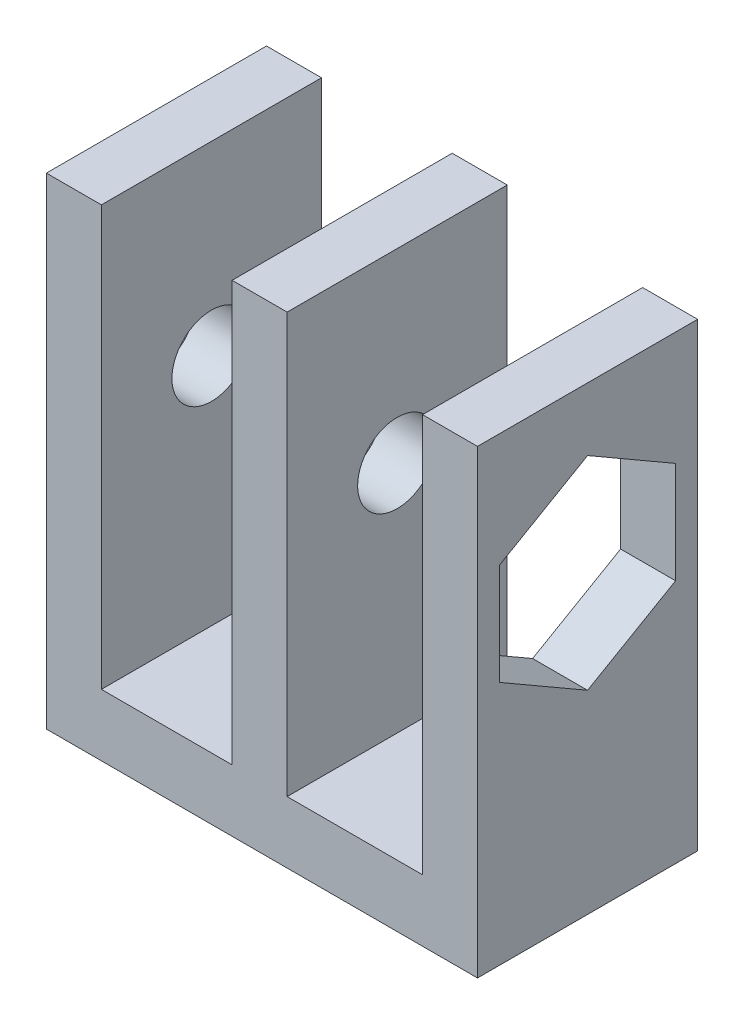
ISO-10303-21;
HEADER;
FILE_DESCRIPTION(('STEP AP214'),'2;1');
FILE_NAME('part.step','',(''),(''),'','','');
FILE_SCHEMA(('AUTOMOTIVE_DESIGN { 1 0 10303 214 1 1 1 1 }'));
ENDSEC;
DATA;
#1=APPLICATION_CONTEXT('core data for automotive mechanical design processes');
#2=APPLICATION_PROTOCOL_DEFINITION('international standard','automotive_design',2000,#1);
#3=PRODUCT_CONTEXT('',#1,'mechanical');
#4=PRODUCT('Part','Part','',(#3));
#5=PRODUCT_RELATED_PRODUCT_CATEGORY('part','',(#4));
#6=PRODUCT_DEFINITION_FORMATION('','',#4);
#7=PRODUCT_DEFINITION_CONTEXT('part definition',#1,'design');
#8=PRODUCT_DEFINITION('design','',#6,#7);
#9=PRODUCT_DEFINITION_SHAPE('','',#8);
#10=(LENGTH_UNIT() NAMED_UNIT(*) SI_UNIT(.MILLI.,.METRE.));
#11=(NAMED_UNIT(*) PLANE_ANGLE_UNIT() SI_UNIT($,.RADIAN.));
#12=(NAMED_UNIT(*) SI_UNIT($,.STERADIAN.) SOLID_ANGLE_UNIT());
#13=UNCERTAINTY_MEASURE_WITH_UNIT(LENGTH_MEASURE(1.E-05),#10,'distance_accuracy_value','');
#14=(GEOMETRIC_REPRESENTATION_CONTEXT(3) GLOBAL_UNCERTAINTY_ASSIGNED_CONTEXT((#13)) GLOBAL_UNIT_ASSIGNED_CONTEXT((#10,
#11,#12)) REPRESENTATION_CONTEXT('',''));
#15=CARTESIAN_POINT('',(0.,0.,0.));
#16=DIRECTION('',(0.,0.,1.));
#17=DIRECTION('',(1.,0.,0.));
#18=AXIS2_PLACEMENT_3D('',#15,#16,#17);
#19=CARTESIAN_POINT('',(0.,17.78,8.128));
#20=DIRECTION('',(0.,1.,0.));
#21=DIRECTION('',(0.,0.,1.));
#22=AXIS2_PLACEMENT_3D('',#19,#20,#21);
#23=PLANE('',#22);
#24=DIRECTION('',(1.,0.,0.));
#25=VECTOR('',#24,1.);
#26=CARTESIAN_POINT('',(0.,17.78,0.));
#27=LINE('',#26,#25);
#28=CARTESIAN_POINT('',(0.,17.78,0.));
#29=VERTEX_POINT('',#28);
#30=CARTESIAN_POINT('',(2.03199999999999,17.78,0.));
#31=VERTEX_POINT('',#30);
#32=EDGE_CURVE('E208',#29,#31,#27,.T.);
#33=ORIENTED_EDGE('',*,*,#32,.F.);
#34=DIRECTION('',(0.,0.,-1.));
#35=VECTOR('',#34,1.);
#36=CARTESIAN_POINT('',(0.,17.78,8.128));
#37=LINE('',#36,#35);
#38=CARTESIAN_POINT('',(0.,17.78,8.128));
#39=VERTEX_POINT('',#38);
#40=EDGE_CURVE('E11',#39,#29,#37,.T.);
#41=ORIENTED_EDGE('',*,*,#40,.F.);
#42=DIRECTION('',(1.,0.,0.));
#43=VECTOR('',#42,1.);
#44=CARTESIAN_POINT('',(0.,17.78,8.128));
#45=LINE('',#44,#43);
#46=CARTESIAN_POINT('',(2.03199999999999,17.78,8.128));
#47=VERTEX_POINT('',#46);
#48=EDGE_CURVE('E209',#39,#47,#45,.T.);
#49=ORIENTED_EDGE('',*,*,#48,.T.);
#50=DIRECTION('',(0.,0.,-1.));
#51=VECTOR('',#50,1.);
#52=CARTESIAN_POINT('',(2.03199999999999,17.78,8.128));
#53=LINE('',#52,#51);
#54=EDGE_CURVE('E242',#47,#31,#53,.T.);
#55=ORIENTED_EDGE('',*,*,#54,.T.);
#56=EDGE_LOOP('',(#33,#41,#49,#55));
#57=FACE_BOUND('',#56,.T.);
#58=ADVANCED_FACE('F35',(#57),#23,.T.);
#59=CARTESIAN_POINT('',(0.,0.,8.128));
#60=DIRECTION('',(-1.,0.,0.));
#61=DIRECTION('',(0.,-1.,0.));
#62=AXIS2_PLACEMENT_3D('',#59,#60,#61);
#63=PLANE('',#62);
#64=CARTESIAN_POINT('',(0.,10.922,4.064));
#65=DIRECTION('',(-1.,0.,0.));
#66=DIRECTION('',(0.,-1.,0.));
#67=AXIS2_PLACEMENT_3D('',#64,#65,#66);
#68=CIRCLE('',#67,1.4605);
#69=CARTESIAN_POINT('',(0.,9.4615,4.064));
#70=VERTEX_POINT('',#69);
#71=EDGE_CURVE('E205',#70,#70,#68,.T.);
#72=ORIENTED_EDGE('',*,*,#71,.F.);
#73=EDGE_LOOP('',(#72));
#74=FACE_BOUND('',#73,.T.);
#75=DIRECTION('',(0.,1.,0.));
#76=VECTOR('',#75,1.);
#77=CARTESIAN_POINT('',(0.,0.,0.));
#78=LINE('',#77,#76);
#79=CARTESIAN_POINT('',(0.,0.,0.));
#80=VERTEX_POINT('',#79);
#81=EDGE_CURVE('E245',#80,#29,#78,.T.);
#82=ORIENTED_EDGE('',*,*,#81,.F.);
#83=DIRECTION('',(0.,0.,-1.));
#84=VECTOR('',#83,1.);
#85=CARTESIAN_POINT('',(0.,0.,8.128));
#86=LINE('',#85,#84);
#87=CARTESIAN_POINT('',(0.,0.,8.128));
#88=VERTEX_POINT('',#87);
#89=EDGE_CURVE('E43',#88,#80,#86,.T.);
#90=ORIENTED_EDGE('',*,*,#89,.F.);
#91=DIRECTION('',(0.,1.,0.));
#92=VECTOR('',#91,1.);
#93=CARTESIAN_POINT('',(0.,0.,8.128));
#94=LINE('',#93,#92);
#95=EDGE_CURVE('E212',#88,#39,#94,.T.);
#96=ORIENTED_EDGE('',*,*,#95,.T.);
#97=ORIENTED_EDGE('',*,*,#40,.T.);
#98=EDGE_LOOP('',(#82,#90,#96,#97));
#99=FACE_BOUND('',#98,.T.);
#100=ADVANCED_FACE('F303',(#74,#99),#63,.T.);
#101=CARTESIAN_POINT('',(0.,0.,8.128));
#102=DIRECTION('',(0.,-1.,0.));
#103=DIRECTION('',(0.,0.,-1.));
#104=AXIS2_PLACEMENT_3D('',#101,#102,#103);
#105=PLANE('',#104);
#106=DIRECTION('',(-1.,0.,0.));
#107=VECTOR('',#106,1.);
#108=CARTESIAN_POINT('',(0.,0.,0.));
#109=LINE('',#108,#107);
#110=CARTESIAN_POINT('',(15.92,0.,0.));
#111=VERTEX_POINT('',#110);
#112=EDGE_CURVE('E248',#111,#80,#109,.T.);
#113=ORIENTED_EDGE('',*,*,#112,.F.);
#114=DIRECTION('',(0.,0.,-1.));
#115=VECTOR('',#114,1.);
#116=CARTESIAN_POINT('',(15.92,0.,8.128));
#117=LINE('',#116,#115);
#118=CARTESIAN_POINT('',(15.92,0.,8.128));
#119=VERTEX_POINT('',#118);
#120=EDGE_CURVE('E294',#119,#111,#117,.T.);
#121=ORIENTED_EDGE('',*,*,#120,.F.);
#122=DIRECTION('',(-1.,0.,0.));
#123=VECTOR('',#122,1.);
#124=CARTESIAN_POINT('',(0.,0.,8.128));
#125=LINE('',#124,#123);
#126=EDGE_CURVE('E216',#119,#88,#125,.T.);
#127=ORIENTED_EDGE('',*,*,#126,.T.);
#128=ORIENTED_EDGE('',*,*,#89,.T.);
#129=EDGE_LOOP('',(#113,#121,#127,#128));
#130=FACE_BOUND('',#129,.T.);
#131=ADVANCED_FACE('F299',(#130),#105,.T.);
#132=CARTESIAN_POINT('',(15.92,0.,8.128));
#133=DIRECTION('',(-1.,0.,0.));
#134=DIRECTION('',(0.,0.,1.));
#135=AXIS2_PLACEMENT_3D('',#132,#133,#134);
#136=PLANE('',#135);
#137=DIRECTION('',(0.,-0.5,0.866025403784439));
#138=VECTOR('',#137,1.);
#139=CARTESIAN_POINT('',(15.92,14.6747767497326,4.064));
#140=LINE('',#139,#138);
#141=CARTESIAN_POINT('',(15.92,14.6747767497326,4.064));
#142=VERTEX_POINT('',#141);
#143=CARTESIAN_POINT('',(15.92,12.7983883748663,7.314));
#144=VERTEX_POINT('',#143);
#145=EDGE_CURVE('E375',#142,#144,#140,.T.);
#146=ORIENTED_EDGE('',*,*,#145,.F.);
#147=DIRECTION('',(0.,0.499999999999999,0.866025403784439));
#148=VECTOR('',#147,1.);
#149=CARTESIAN_POINT('',(15.92,12.7983883748663,0.814000000000001));
#150=LINE('',#149,#148);
#151=CARTESIAN_POINT('',(15.92,12.7983883748663,0.814000000000001));
#152=VERTEX_POINT('',#151);
#153=EDGE_CURVE('E50',#152,#142,#150,.T.);
#154=ORIENTED_EDGE('',*,*,#153,.F.);
#155=DIRECTION('',(0.,1.,0.));
#156=VECTOR('',#155,1.);
#157=CARTESIAN_POINT('',(15.92,9.04561162513372,0.814));
#158=LINE('',#157,#156);
#159=CARTESIAN_POINT('',(15.92,9.04561162513372,0.814));
#160=VERTEX_POINT('',#159);
#161=EDGE_CURVE('E166',#160,#152,#158,.T.);
#162=ORIENTED_EDGE('',*,*,#161,.F.);
#163=DIRECTION('',(0.,0.5,-0.866025403784438));
#164=VECTOR('',#163,1.);
#165=CARTESIAN_POINT('',(15.92,7.16922325026743,4.064));
#166=LINE('',#165,#164);
#167=CARTESIAN_POINT('',(15.92,7.16922325026743,4.064));
#168=VERTEX_POINT('',#167);
#169=EDGE_CURVE('E386',#168,#160,#166,.T.);
#170=ORIENTED_EDGE('',*,*,#169,.F.);
#171=DIRECTION('',(0.,-0.5,-0.866025403784439));
#172=VECTOR('',#171,1.);
#173=CARTESIAN_POINT('',(15.92,9.04561162513371,7.314));
#174=LINE('',#173,#172);
#175=CARTESIAN_POINT('',(15.92,9.04561162513371,7.314));
#176=VERTEX_POINT('',#175);
#177=EDGE_CURVE('E381',#176,#168,#174,.T.);
#178=ORIENTED_EDGE('',*,*,#177,.F.);
#179=DIRECTION('',(0.,-1.,0.));
#180=VECTOR('',#179,1.);
#181=CARTESIAN_POINT('',(15.92,12.7983883748663,7.314));
#182=LINE('',#181,#180);
#183=EDGE_CURVE('E378',#144,#176,#182,.T.);
#184=ORIENTED_EDGE('',*,*,#183,.F.);
#185=EDGE_LOOP('',(#146,#154,#162,#170,#178,#184));
#186=FACE_BOUND('',#185,.T.);
#187=DIRECTION('',(0.,1.,0.));
#188=VECTOR('',#187,1.);
#189=CARTESIAN_POINT('',(15.92,0.,0.));
#190=LINE('',#189,#188);
#191=CARTESIAN_POINT('',(15.92,17.,0.));
#192=VERTEX_POINT('',#191);
#193=EDGE_CURVE('E251',#111,#192,#190,.T.);
#194=ORIENTED_EDGE('',*,*,#193,.T.);
#195=DIRECTION('',(0.,0.,-1.));
#196=VECTOR('',#195,1.);
#197=CARTESIAN_POINT('',(15.92,17.,8.128));
#198=LINE('',#197,#196);
#199=CARTESIAN_POINT('',(15.92,17.,8.128));
#200=VERTEX_POINT('',#199);
#201=EDGE_CURVE('E291',#200,#192,#198,.T.);
#202=ORIENTED_EDGE('',*,*,#201,.F.);
#203=DIRECTION('',(0.,1.,0.));
#204=VECTOR('',#203,1.);
#205=CARTESIAN_POINT('',(15.92,0.,8.128));
#206=LINE('',#205,#204);
#207=EDGE_CURVE('E219',#119,#200,#206,.T.);
#208=ORIENTED_EDGE('',*,*,#207,.F.);
#209=ORIENTED_EDGE('',*,*,#120,.T.);
#210=EDGE_LOOP('',(#194,#202,#208,#209));
#211=FACE_BOUND('',#210,.T.);
#212=ADVANCED_FACE('F312',(#186,#211),#136,.F.);
#213=CARTESIAN_POINT('',(0.,17.,8.128));
#214=DIRECTION('',(0.,-1.,0.));
#215=DIRECTION('',(0.,0.,-1.));
#216=AXIS2_PLACEMENT_3D('',#213,#214,#215);
#217=PLANE('',#216);
#218=DIRECTION('',(-1.,0.,0.));
#219=VECTOR('',#218,1.);
#220=CARTESIAN_POINT('',(0.,17.,0.));
#221=LINE('',#220,#219);
#222=CARTESIAN_POINT('',(13.89,17.,0.));
#223=VERTEX_POINT('',#222);
#224=EDGE_CURVE('E253',#192,#223,#221,.T.);
#225=ORIENTED_EDGE('',*,*,#224,.T.);
#226=DIRECTION('',(0.,0.,-1.));
#227=VECTOR('',#226,1.);
#228=CARTESIAN_POINT('',(13.89,17.,8.128));
#229=LINE('',#228,#227);
#230=CARTESIAN_POINT('',(13.89,17.,8.128));
#231=VERTEX_POINT('',#230);
#232=EDGE_CURVE('E288',#231,#223,#229,.T.);
#233=ORIENTED_EDGE('',*,*,#232,.F.);
#234=DIRECTION('',(-1.,0.,0.));
#235=VECTOR('',#234,1.);
#236=CARTESIAN_POINT('',(0.,17.,8.128));
#237=LINE('',#236,#235);
#238=EDGE_CURVE('E221',#200,#231,#237,.T.);
#239=ORIENTED_EDGE('',*,*,#238,.F.);
#240=ORIENTED_EDGE('',*,*,#201,.T.);
#241=EDGE_LOOP('',(#225,#233,#239,#240));
#242=FACE_BOUND('',#241,.T.);
#243=ADVANCED_FACE('F316',(#242),#217,.F.);
#244=CARTESIAN_POINT('',(13.89,0.,8.128));
#245=DIRECTION('',(1.,0.,0.));
#246=DIRECTION('',(0.,0.,-1.));
#247=AXIS2_PLACEMENT_3D('',#244,#245,#246);
#248=PLANE('',#247);
#249=DIRECTION('',(0.,-1.,0.));
#250=VECTOR('',#249,1.);
#251=CARTESIAN_POINT('',(13.89,9.04561162513371,0.814));
#252=LINE('',#251,#250);
#253=CARTESIAN_POINT('',(13.89,12.7983883748663,0.814000000000001));
#254=VERTEX_POINT('',#253);
#255=CARTESIAN_POINT('',(13.89,9.04561162513372,0.814));
#256=VERTEX_POINT('',#255);
#257=EDGE_CURVE('E163',#254,#256,#252,.T.);
#258=ORIENTED_EDGE('',*,*,#257,.F.);
#259=DIRECTION('',(0.,-0.499999999999999,-0.866025403784439));
#260=VECTOR('',#259,1.);
#261=CARTESIAN_POINT('',(13.89,12.7983883748663,0.813999999999999));
#262=LINE('',#261,#260);
#263=CARTESIAN_POINT('',(13.89,14.6747767497326,4.064));
#264=VERTEX_POINT('',#263);
#265=EDGE_CURVE('E171',#264,#254,#262,.T.);
#266=ORIENTED_EDGE('',*,*,#265,.F.);
#267=DIRECTION('',(0.,0.5,-0.866025403784439));
#268=VECTOR('',#267,1.);
#269=CARTESIAN_POINT('',(13.89,14.6747767497326,4.064));
#270=LINE('',#269,#268);
#271=CARTESIAN_POINT('',(13.89,12.7983883748663,7.314));
#272=VERTEX_POINT('',#271);
#273=EDGE_CURVE('E176',#272,#264,#270,.T.);
#274=ORIENTED_EDGE('',*,*,#273,.F.);
#275=DIRECTION('',(0.,1.,0.));
#276=VECTOR('',#275,1.);
#277=CARTESIAN_POINT('',(13.89,12.7983883748663,7.314));
#278=LINE('',#277,#276);
#279=CARTESIAN_POINT('',(13.89,9.04561162513371,7.314));
#280=VERTEX_POINT('',#279);
#281=EDGE_CURVE('E58',#280,#272,#278,.T.);
#282=ORIENTED_EDGE('',*,*,#281,.F.);
#283=DIRECTION('',(0.,0.5,0.866025403784439));
#284=VECTOR('',#283,1.);
#285=CARTESIAN_POINT('',(13.89,9.04561162513371,7.31399999999999));
#286=LINE('',#285,#284);
#287=CARTESIAN_POINT('',(13.89,7.16922325026743,4.064));
#288=VERTEX_POINT('',#287);
#289=EDGE_CURVE('E184',#288,#280,#286,.T.);
#290=ORIENTED_EDGE('',*,*,#289,.F.);
#291=DIRECTION('',(0.,-0.5,0.866025403784439));
#292=VECTOR('',#291,1.);
#293=CARTESIAN_POINT('',(13.89,7.16922325026743,4.064));
#294=LINE('',#293,#292);
#295=EDGE_CURVE('E182',#256,#288,#294,.T.);
#296=ORIENTED_EDGE('',*,*,#295,.F.);
#297=EDGE_LOOP('',(#258,#266,#274,#282,#290,#296));
#298=FACE_BOUND('',#297,.T.);
#299=DIRECTION('',(0.,-1.,0.));
#300=VECTOR('',#299,1.);
#301=CARTESIAN_POINT('',(13.89,0.,0.));
#302=LINE('',#301,#300);
#303=CARTESIAN_POINT('',(13.89,2.286,0.));
#304=VERTEX_POINT('',#303);
#305=EDGE_CURVE('E255',#223,#304,#302,.T.);
#306=ORIENTED_EDGE('',*,*,#305,.T.);
#307=DIRECTION('',(0.,0.,-1.));
#308=VECTOR('',#307,1.);
#309=CARTESIAN_POINT('',(13.89,2.286,8.128));
#310=LINE('',#309,#308);
#311=CARTESIAN_POINT('',(13.89,2.286,8.128));
#312=VERTEX_POINT('',#311);
#313=EDGE_CURVE('E285',#312,#304,#310,.T.);
#314=ORIENTED_EDGE('',*,*,#313,.F.);
#315=DIRECTION('',(0.,-1.,0.));
#316=VECTOR('',#315,1.);
#317=CARTESIAN_POINT('',(13.89,0.,8.128));
#318=LINE('',#317,#316);
#319=EDGE_CURVE('E223',#231,#312,#318,.T.);
#320=ORIENTED_EDGE('',*,*,#319,.F.);
#321=ORIENTED_EDGE('',*,*,#232,.T.);
#322=EDGE_LOOP('',(#306,#314,#320,#321));
#323=FACE_BOUND('',#322,.T.);
#324=ADVANCED_FACE('F178',(#298,#323),#248,.F.);
#325=CARTESIAN_POINT('',(0.,2.286,8.128));
#326=DIRECTION('',(0.,-1.,0.));
#327=DIRECTION('',(1.,0.,0.));
#328=AXIS2_PLACEMENT_3D('',#325,#326,#327);
#329=PLANE('',#328);
#330=DIRECTION('',(-1.,0.,0.));
#331=VECTOR('',#330,1.);
#332=CARTESIAN_POINT('',(0.,2.286,0.));
#333=LINE('',#332,#331);
#334=CARTESIAN_POINT('',(8.89,2.286,0.));
#335=VERTEX_POINT('',#334);
#336=EDGE_CURVE('E257',#304,#335,#333,.T.);
#337=ORIENTED_EDGE('',*,*,#336,.T.);
#338=DIRECTION('',(0.,0.,-1.));
#339=VECTOR('',#338,1.);
#340=CARTESIAN_POINT('',(8.89,2.286,8.128));
#341=LINE('',#340,#339);
#342=CARTESIAN_POINT('',(8.89,2.286,8.128));
#343=VERTEX_POINT('',#342);
#344=EDGE_CURVE('E283',#343,#335,#341,.T.);
#345=ORIENTED_EDGE('',*,*,#344,.F.);
#346=DIRECTION('',(-1.,0.,0.));
#347=VECTOR('',#346,1.);
#348=CARTESIAN_POINT('',(0.,2.286,8.128));
#349=LINE('',#348,#347);
#350=EDGE_CURVE('E225',#312,#343,#349,.T.);
#351=ORIENTED_EDGE('',*,*,#350,.F.);
#352=ORIENTED_EDGE('',*,*,#313,.T.);
#353=EDGE_LOOP('',(#337,#345,#351,#352));
#354=FACE_BOUND('',#353,.T.);
#355=ADVANCED_FACE('F347',(#354),#329,.F.);
#356=CARTESIAN_POINT('',(8.89,0.,8.128));
#357=DIRECTION('',(1.,0.,0.));
#358=DIRECTION('',(0.,1.,0.));
#359=AXIS2_PLACEMENT_3D('',#356,#357,#358);
#360=PLANE('',#359);
#361=CARTESIAN_POINT('',(8.89,10.922,4.064));
#362=DIRECTION('',(1.,0.,0.));
#363=DIRECTION('',(0.,1.,0.));
#364=AXIS2_PLACEMENT_3D('',#361,#362,#363);
#365=CIRCLE('',#364,1.4605);
#366=CARTESIAN_POINT('',(8.89,12.3825,4.064));
#367=VERTEX_POINT('',#366);
#368=EDGE_CURVE('E199',#367,#367,#365,.T.);
#369=ORIENTED_EDGE('',*,*,#368,.F.);
#370=EDGE_LOOP('',(#369));
#371=FACE_BOUND('',#370,.T.);
#372=DIRECTION('',(0.,-1.,0.));
#373=VECTOR('',#372,1.);
#374=CARTESIAN_POINT('',(8.89,0.,0.));
#375=LINE('',#374,#373);
#376=CARTESIAN_POINT('',(8.89,17.78,0.));
#377=VERTEX_POINT('',#376);
#378=EDGE_CURVE('E260',#377,#335,#375,.T.);
#379=ORIENTED_EDGE('',*,*,#378,.F.);
#380=DIRECTION('',(0.,0.,-1.));
#381=VECTOR('',#380,1.);
#382=CARTESIAN_POINT('',(8.89,17.78,8.128));
#383=LINE('',#382,#381);
#384=CARTESIAN_POINT('',(8.89,17.78,8.128));
#385=VERTEX_POINT('',#384);
#386=EDGE_CURVE('E281',#385,#377,#383,.T.);
#387=ORIENTED_EDGE('',*,*,#386,.F.);
#388=DIRECTION('',(0.,-1.,0.));
#389=VECTOR('',#388,1.);
#390=CARTESIAN_POINT('',(8.89,0.,8.128));
#391=LINE('',#390,#389);
#392=EDGE_CURVE('E227',#385,#343,#391,.T.);
#393=ORIENTED_EDGE('',*,*,#392,.T.);
#394=ORIENTED_EDGE('',*,*,#344,.T.);
#395=EDGE_LOOP('',(#379,#387,#393,#394));
#396=FACE_BOUND('',#395,.T.);
#397=ADVANCED_FACE('F343',(#371,#396),#360,.T.);
#398=CARTESIAN_POINT('',(0.,17.78,8.128));
#399=DIRECTION('',(0.,1.,0.));
#400=DIRECTION('',(0.,0.,1.));
#401=AXIS2_PLACEMENT_3D('',#398,#399,#400);
#402=PLANE('',#401);
#403=DIRECTION('',(1.,0.,0.));
#404=VECTOR('',#403,1.);
#405=CARTESIAN_POINT('',(0.,17.78,0.));
#406=LINE('',#405,#404);
#407=CARTESIAN_POINT('',(6.858,17.78,0.));
#408=VERTEX_POINT('',#407);
#409=EDGE_CURVE('E263',#408,#377,#406,.T.);
#410=ORIENTED_EDGE('',*,*,#409,.F.);
#411=DIRECTION('',(0.,0.,-1.));
#412=VECTOR('',#411,1.);
#413=CARTESIAN_POINT('',(6.858,17.78,8.128));
#414=LINE('',#413,#412);
#415=CARTESIAN_POINT('',(6.858,17.78,8.128));
#416=VERTEX_POINT('',#415);
#417=EDGE_CURVE('E279',#416,#408,#414,.T.);
#418=ORIENTED_EDGE('',*,*,#417,.F.);
#419=DIRECTION('',(1.,0.,0.));
#420=VECTOR('',#419,1.);
#421=CARTESIAN_POINT('',(0.,17.78,8.128));
#422=LINE('',#421,#420);
#423=EDGE_CURVE('E230',#416,#385,#422,.T.);
#424=ORIENTED_EDGE('',*,*,#423,.T.);
#425=ORIENTED_EDGE('',*,*,#386,.T.);
#426=EDGE_LOOP('',(#410,#418,#424,#425));
#427=FACE_BOUND('',#426,.T.);
#428=ADVANCED_FACE('F339',(#427),#402,.T.);
#429=CARTESIAN_POINT('',(6.858,0.,8.128));
#430=DIRECTION('',(-1.,0.,0.));
#431=DIRECTION('',(0.,-1.,0.));
#432=AXIS2_PLACEMENT_3D('',#429,#430,#431);
#433=PLANE('',#432);
#434=CARTESIAN_POINT('',(6.858,10.922,4.064));
#435=DIRECTION('',(-1.,0.,0.));
#436=DIRECTION('',(0.,-1.,0.));
#437=AXIS2_PLACEMENT_3D('',#434,#435,#436);
#438=CIRCLE('',#437,1.4605);
#439=CARTESIAN_POINT('',(6.858,9.4615,4.064));
#440=VERTEX_POINT('',#439);
#441=EDGE_CURVE('E202',#440,#440,#438,.T.);
#442=ORIENTED_EDGE('',*,*,#441,.F.);
#443=EDGE_LOOP('',(#442));
#444=FACE_BOUND('',#443,.T.);
#445=DIRECTION('',(0.,1.,0.));
#446=VECTOR('',#445,1.);
#447=CARTESIAN_POINT('',(6.858,0.,0.));
#448=LINE('',#447,#446);
#449=CARTESIAN_POINT('',(6.858,2.286,0.));
#450=VERTEX_POINT('',#449);
#451=EDGE_CURVE('E266',#450,#408,#448,.T.);
#452=ORIENTED_EDGE('',*,*,#451,.F.);
#453=DIRECTION('',(0.,0.,-1.));
#454=VECTOR('',#453,1.);
#455=CARTESIAN_POINT('',(6.858,2.286,8.128));
#456=LINE('',#455,#454);
#457=CARTESIAN_POINT('',(6.858,2.286,8.128));
#458=VERTEX_POINT('',#457);
#459=EDGE_CURVE('E277',#458,#450,#456,.T.);
#460=ORIENTED_EDGE('',*,*,#459,.F.);
#461=DIRECTION('',(0.,1.,0.));
#462=VECTOR('',#461,1.);
#463=CARTESIAN_POINT('',(6.858,0.,8.128));
#464=LINE('',#463,#462);
#465=EDGE_CURVE('E233',#458,#416,#464,.T.);
#466=ORIENTED_EDGE('',*,*,#465,.T.);
#467=ORIENTED_EDGE('',*,*,#417,.T.);
#468=EDGE_LOOP('',(#452,#460,#466,#467));
#469=FACE_BOUND('',#468,.T.);
#470=ADVANCED_FACE('F335',(#444,#469),#433,.T.);
#471=CARTESIAN_POINT('',(0.,2.286,8.128));
#472=DIRECTION('',(0.,1.,0.));
#473=DIRECTION('',(-1.,0.,0.));
#474=AXIS2_PLACEMENT_3D('',#471,#472,#473);
#475=PLANE('',#474);
#476=DIRECTION('',(1.,0.,0.));
#477=VECTOR('',#476,1.);
#478=CARTESIAN_POINT('',(0.,2.286,0.));
#479=LINE('',#478,#477);
#480=CARTESIAN_POINT('',(2.032,2.286,0.));
#481=VERTEX_POINT('',#480);
#482=EDGE_CURVE('E269',#481,#450,#479,.T.);
#483=ORIENTED_EDGE('',*,*,#482,.F.);
#484=DIRECTION('',(0.,0.,-1.));
#485=VECTOR('',#484,1.);
#486=CARTESIAN_POINT('',(2.032,2.286,8.128));
#487=LINE('',#486,#485);
#488=CARTESIAN_POINT('',(2.032,2.286,8.128));
#489=VERTEX_POINT('',#488);
#490=EDGE_CURVE('E275',#489,#481,#487,.T.);
#491=ORIENTED_EDGE('',*,*,#490,.F.);
#492=DIRECTION('',(1.,0.,0.));
#493=VECTOR('',#492,1.);
#494=CARTESIAN_POINT('',(0.,2.286,8.128));
#495=LINE('',#494,#493);
#496=EDGE_CURVE('E236',#489,#458,#495,.T.);
#497=ORIENTED_EDGE('',*,*,#496,.T.);
#498=ORIENTED_EDGE('',*,*,#459,.T.);
#499=EDGE_LOOP('',(#483,#491,#497,#498));
#500=FACE_BOUND('',#499,.T.);
#501=ADVANCED_FACE('F331',(#500),#475,.T.);
#502=CARTESIAN_POINT('',(2.032,0.,8.128));
#503=DIRECTION('',(1.,0.,0.));
#504=DIRECTION('',(0.,1.,0.));
#505=AXIS2_PLACEMENT_3D('',#502,#503,#504);
#506=PLANE('',#505);
#507=CARTESIAN_POINT('',(2.032,10.922,4.064));
#508=DIRECTION('',(1.,0.,0.));
#509=DIRECTION('',(0.,1.,0.));
#510=AXIS2_PLACEMENT_3D('',#507,#508,#509);
#511=CIRCLE('',#510,1.4605);
#512=CARTESIAN_POINT('',(2.032,12.3825,4.064));
#513=VERTEX_POINT('',#512);
#514=EDGE_CURVE('E38',#513,#513,#511,.T.);
#515=ORIENTED_EDGE('',*,*,#514,.F.);
#516=EDGE_LOOP('',(#515));
#517=FACE_BOUND('',#516,.T.);
#518=DIRECTION('',(0.,-1.,0.));
#519=VECTOR('',#518,1.);
#520=CARTESIAN_POINT('',(2.032,0.,0.));
#521=LINE('',#520,#519);
#522=EDGE_CURVE('E213',#31,#481,#521,.T.);
#523=ORIENTED_EDGE('',*,*,#522,.F.);
#524=ORIENTED_EDGE('',*,*,#54,.F.);
#525=DIRECTION('',(0.,-1.,0.));
#526=VECTOR('',#525,1.);
#527=CARTESIAN_POINT('',(2.032,0.,8.128));
#528=LINE('',#527,#526);
#529=EDGE_CURVE('E239',#47,#489,#528,.T.);
#530=ORIENTED_EDGE('',*,*,#529,.T.);
#531=ORIENTED_EDGE('',*,*,#490,.T.);
#532=EDGE_LOOP('',(#523,#524,#530,#531));
#533=FACE_BOUND('',#532,.T.);
#534=ADVANCED_FACE('F328',(#517,#533),#506,.T.);
#535=CARTESIAN_POINT('',(0.,0.,8.128));
#536=DIRECTION('',(0.,0.,1.));
#537=DIRECTION('',(1.,0.,0.));
#538=AXIS2_PLACEMENT_3D('',#535,#536,#537);
#539=PLANE('',#538);
#540=ORIENTED_EDGE('',*,*,#48,.F.);
#541=ORIENTED_EDGE('',*,*,#95,.F.);
#542=ORIENTED_EDGE('',*,*,#126,.F.);
#543=ORIENTED_EDGE('',*,*,#207,.T.);
#544=ORIENTED_EDGE('',*,*,#238,.T.);
#545=ORIENTED_EDGE('',*,*,#319,.T.);
#546=ORIENTED_EDGE('',*,*,#350,.T.);
#547=ORIENTED_EDGE('',*,*,#392,.F.);
#548=ORIENTED_EDGE('',*,*,#423,.F.);
#549=ORIENTED_EDGE('',*,*,#465,.F.);
#550=ORIENTED_EDGE('',*,*,#496,.F.);
#551=ORIENTED_EDGE('',*,*,#529,.F.);
#552=EDGE_LOOP('',(#540,#541,#542,#543,#544,#545,#546,#547,#548,#549,#550,#551));
#553=FACE_BOUND('',#552,.T.);
#554=ADVANCED_FACE('F321',(#553),#539,.T.);
#555=CARTESIAN_POINT('',(0.,0.,0.));
#556=DIRECTION('',(0.,0.,1.));
#557=DIRECTION('',(1.,0.,0.));
#558=AXIS2_PLACEMENT_3D('',#555,#556,#557);
#559=PLANE('',#558);
#560=ORIENTED_EDGE('',*,*,#32,.T.);
#561=ORIENTED_EDGE('',*,*,#522,.T.);
#562=ORIENTED_EDGE('',*,*,#482,.T.);
#563=ORIENTED_EDGE('',*,*,#451,.T.);
#564=ORIENTED_EDGE('',*,*,#409,.T.);
#565=ORIENTED_EDGE('',*,*,#378,.T.);
#566=ORIENTED_EDGE('',*,*,#336,.F.);
#567=ORIENTED_EDGE('',*,*,#305,.F.);
#568=ORIENTED_EDGE('',*,*,#224,.F.);
#569=ORIENTED_EDGE('',*,*,#193,.F.);
#570=ORIENTED_EDGE('',*,*,#112,.T.);
#571=ORIENTED_EDGE('',*,*,#81,.T.);
#572=EDGE_LOOP('',(#560,#561,#562,#563,#564,#565,#566,#567,#568,#569,#570,#571));
#573=FACE_BOUND('',#572,.T.);
#574=ADVANCED_FACE('F307',(#573),#559,.F.);
#575=CARTESIAN_POINT('',(-1.11,10.922,4.064));
#576=DIRECTION('',(1.,0.,0.));
#577=DIRECTION('',(0.,1.,0.));
#578=AXIS2_PLACEMENT_3D('',#575,#576,#577);
#579=CYLINDRICAL_SURFACE('',#578,1.4605);
#580=ORIENTED_EDGE('',*,*,#71,.T.);
#581=EDGE_LOOP('',(#580));
#582=FACE_BOUND('',#581,.T.);
#583=ORIENTED_EDGE('',*,*,#514,.T.);
#584=EDGE_LOOP('',(#583));
#585=FACE_BOUND('',#584,.T.);
#586=ADVANCED_FACE('F410',(#582,#585),#579,.F.);
#587=ORIENTED_EDGE('',*,*,#441,.T.);
#588=EDGE_LOOP('',(#587));
#589=FACE_BOUND('',#588,.T.);
#590=ORIENTED_EDGE('',*,*,#368,.T.);
#591=EDGE_LOOP('',(#590));
#592=FACE_BOUND('',#591,.T.);
#593=ADVANCED_FACE('F409',(#589,#592),#579,.F.);
#594=CARTESIAN_POINT('',(-0.00100000000001141,12.7983883748663,0.814000000000001));
#595=DIRECTION('',(0.,0.866025403784439,-0.499999999999999));
#596=DIRECTION('',(0.,0.499999999999999,0.866025403784439));
#597=AXIS2_PLACEMENT_3D('',#594,#595,#596);
#598=PLANE('',#597);
#599=ORIENTED_EDGE('',*,*,#265,.T.);
#600=DIRECTION('',(1.,0.,0.));
#601=VECTOR('',#600,1.);
#602=CARTESIAN_POINT('',(-0.00100000000001141,12.7983883748663,0.814000000000001));
#603=LINE('',#602,#601);
#604=EDGE_CURVE('E159',#254,#152,#603,.T.);
#605=ORIENTED_EDGE('',*,*,#604,.T.);
#606=ORIENTED_EDGE('',*,*,#153,.T.);
#607=DIRECTION('',(1.,0.,0.));
#608=VECTOR('',#607,1.);
#609=CARTESIAN_POINT('',(-0.00100000000001141,14.6747767497326,4.064));
#610=LINE('',#609,#608);
#611=EDGE_CURVE('E168',#264,#142,#610,.T.);
#612=ORIENTED_EDGE('',*,*,#611,.F.);
#613=EDGE_LOOP('',(#599,#605,#606,#612));
#614=FACE_BOUND('',#613,.T.);
#615=ADVANCED_FACE('F172',(#614),#598,.F.);
#616=CARTESIAN_POINT('',(-0.00100000000000794,9.04561162513371,0.814));
#617=DIRECTION('',(0.,0.,-1.));
#618=DIRECTION('',(0.,1.,0.));
#619=AXIS2_PLACEMENT_3D('',#616,#617,#618);
#620=PLANE('',#619);
#621=ORIENTED_EDGE('',*,*,#257,.T.);
#622=DIRECTION('',(1.,0.,0.));
#623=VECTOR('',#622,1.);
#624=CARTESIAN_POINT('',(-0.00100000000000794,9.04561162513371,0.814));
#625=LINE('',#624,#623);
#626=EDGE_CURVE('E167',#256,#160,#625,.T.);
#627=ORIENTED_EDGE('',*,*,#626,.T.);
#628=ORIENTED_EDGE('',*,*,#161,.T.);
#629=ORIENTED_EDGE('',*,*,#604,.F.);
#630=EDGE_LOOP('',(#621,#627,#628,#629));
#631=FACE_BOUND('',#630,.T.);
#632=ADVANCED_FACE('F161',(#631),#620,.F.);
#633=CARTESIAN_POINT('',(-0.00100000000000794,7.16922325026742,4.064));
#634=DIRECTION('',(0.,-0.866025403784439,-0.5));
#635=DIRECTION('',(0.,0.5,-0.866025403784439));
#636=AXIS2_PLACEMENT_3D('',#633,#634,#635);
#637=PLANE('',#636);
#638=ORIENTED_EDGE('',*,*,#295,.T.);
#639=DIRECTION('',(1.,0.,0.));
#640=VECTOR('',#639,1.);
#641=CARTESIAN_POINT('',(-0.00100000000000794,7.16922325026742,4.064));
#642=LINE('',#641,#640);
#643=EDGE_CURVE('E193',#288,#168,#642,.T.);
#644=ORIENTED_EDGE('',*,*,#643,.T.);
#645=ORIENTED_EDGE('',*,*,#169,.T.);
#646=ORIENTED_EDGE('',*,*,#626,.F.);
#647=EDGE_LOOP('',(#638,#644,#645,#646));
#648=FACE_BOUND('',#647,.T.);
#649=ADVANCED_FACE('F395',(#648),#637,.F.);
#650=CARTESIAN_POINT('',(-0.00100000000000794,9.0456116251337,7.314));
#651=DIRECTION('',(0.,-0.866025403784439,0.5));
#652=DIRECTION('',(0.,-0.5,-0.866025403784439));
#653=AXIS2_PLACEMENT_3D('',#650,#651,#652);
#654=PLANE('',#653);
#655=ORIENTED_EDGE('',*,*,#289,.T.);
#656=DIRECTION('',(1.,0.,0.));
#657=VECTOR('',#656,1.);
#658=CARTESIAN_POINT('',(-0.00100000000000794,9.0456116251337,7.314));
#659=LINE('',#658,#657);
#660=EDGE_CURVE('E195',#280,#176,#659,.T.);
#661=ORIENTED_EDGE('',*,*,#660,.T.);
#662=ORIENTED_EDGE('',*,*,#177,.T.);
#663=ORIENTED_EDGE('',*,*,#643,.F.);
#664=EDGE_LOOP('',(#655,#661,#662,#663));
#665=FACE_BOUND('',#664,.T.);
#666=ADVANCED_FACE('F392',(#665),#654,.F.);
#667=CARTESIAN_POINT('',(-0.00100000000001141,12.7983883748663,7.314));
#668=DIRECTION('',(0.,0.,1.));
#669=DIRECTION('',(0.,-1.,0.));
#670=AXIS2_PLACEMENT_3D('',#667,#668,#669);
#671=PLANE('',#670);
#672=ORIENTED_EDGE('',*,*,#281,.T.);
#673=DIRECTION('',(1.,0.,0.));
#674=VECTOR('',#673,1.);
#675=CARTESIAN_POINT('',(-0.00100000000001141,12.7983883748663,7.314));
#676=LINE('',#675,#674);
#677=EDGE_CURVE('E197',#272,#144,#676,.T.);
#678=ORIENTED_EDGE('',*,*,#677,.T.);
#679=ORIENTED_EDGE('',*,*,#183,.T.);
#680=ORIENTED_EDGE('',*,*,#660,.F.);
#681=EDGE_LOOP('',(#672,#678,#679,#680));
#682=FACE_BOUND('',#681,.T.);
#683=ADVANCED_FACE('F402',(#682),#671,.F.);
#684=CARTESIAN_POINT('',(-0.00100000000001141,14.6747767497326,4.064));
#685=DIRECTION('',(0.,0.866025403784439,0.5));
#686=DIRECTION('',(0.,-0.5,0.866025403784439));
#687=AXIS2_PLACEMENT_3D('',#684,#685,#686);
#688=PLANE('',#687);
#689=ORIENTED_EDGE('',*,*,#273,.T.);
#690=ORIENTED_EDGE('',*,*,#611,.T.);
#691=ORIENTED_EDGE('',*,*,#145,.T.);
#692=ORIENTED_EDGE('',*,*,#677,.F.);
#693=EDGE_LOOP('',(#689,#690,#691,#692));
#694=FACE_BOUND('',#693,.T.);
#695=ADVANCED_FACE('F390',(#694),#688,.F.);
#696=CLOSED_SHELL('',(#58,#100,#131,#212,#243,#324,#355,#397,#428,#470,#501,#534,#554,#574,#586,
#593,#615,#632,#649,#666,#683,#695));
#697=MANIFOLD_SOLID_BREP('B2',#696);
#698=ADVANCED_BREP_SHAPE_REPRESENTATION('',(#18,#697),#14);
#699=SHAPE_DEFINITION_REPRESENTATION(#9,#698);
ENDSEC;
END-ISO-10303-21;
